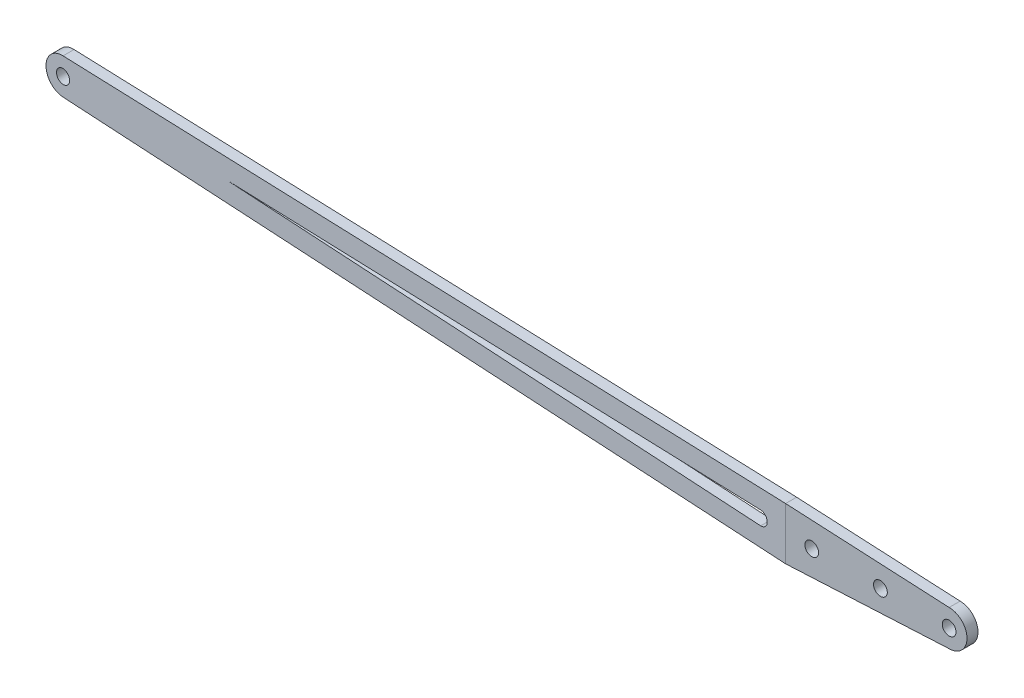
ISO-10303-21;
HEADER;
FILE_DESCRIPTION(('STEP AP214'),'2;1');
FILE_NAME('part.step','',(''),(''),'','','');
FILE_SCHEMA(('AUTOMOTIVE_DESIGN { 1 0 10303 214 1 1 1 1 }'));
ENDSEC;
DATA;
#1=APPLICATION_CONTEXT('core data for automotive mechanical design processes');
#2=APPLICATION_PROTOCOL_DEFINITION('international standard','automotive_design',2000,#1);
#3=PRODUCT_CONTEXT('',#1,'mechanical');
#4=PRODUCT('Part','Part','',(#3));
#5=PRODUCT_RELATED_PRODUCT_CATEGORY('part','',(#4));
#6=PRODUCT_DEFINITION_FORMATION('','',#4);
#7=PRODUCT_DEFINITION_CONTEXT('part definition',#1,'design');
#8=PRODUCT_DEFINITION('design','',#6,#7);
#9=PRODUCT_DEFINITION_SHAPE('','',#8);
#10=(LENGTH_UNIT() NAMED_UNIT(*) SI_UNIT(.MILLI.,.METRE.));
#11=(NAMED_UNIT(*) PLANE_ANGLE_UNIT() SI_UNIT($,.RADIAN.));
#12=(NAMED_UNIT(*) SI_UNIT($,.STERADIAN.) SOLID_ANGLE_UNIT());
#13=UNCERTAINTY_MEASURE_WITH_UNIT(LENGTH_MEASURE(1.E-05),#10,'distance_accuracy_value','');
#14=(GEOMETRIC_REPRESENTATION_CONTEXT(3) GLOBAL_UNCERTAINTY_ASSIGNED_CONTEXT((#13)) GLOBAL_UNIT_ASSIGNED_CONTEXT((#10,
#11,#12)) REPRESENTATION_CONTEXT('',''));
#15=CARTESIAN_POINT('',(0.,0.,0.));
#16=DIRECTION('',(0.,0.,1.));
#17=DIRECTION('',(1.,0.,0.));
#18=AXIS2_PLACEMENT_3D('',#15,#16,#17);
#19=CARTESIAN_POINT('',(0.0447099101226533,19.,-0.976698013369607));
#20=DIRECTION('',(-0.0457287086389354,0.,0.998953895435728));
#21=DIRECTION('',(0.998953895435728,0.,0.0457287086389354));
#22=AXIS2_PLACEMENT_3D('',#19,#20,#21);
#23=PLANE('',#22);
#24=DIRECTION('',(0.998878679740043,0.0122712368518434,0.0457252655204403));
#25=VECTOR('',#24,1.);
#26=CARTESIAN_POINT('',(0.119136479948843,12.9289820206382,-0.973291018370011));
#27=LINE('',#26,#25);
#28=CARTESIAN_POINT('',(-279.,9.5,-13.750414893617));
#29=VERTEX_POINT('',#28);
#30=CARTESIAN_POINT('',(-75.5,12.,-4.43487765957447));
#31=VERTEX_POINT('',#30);
#32=EDGE_CURVE('E423',#29,#31,#27,.T.);
#33=ORIENTED_EDGE('',*,*,#32,.F.);
#34=DIRECTION('',(-0.998878679740043,0.0122712368518431,-0.0457252655204403));
#35=VECTOR('',#34,1.);
#36=CARTESIAN_POINT('',(-0.113755580492739,6.07387906118547,-0.983952024072991));
#37=LINE('',#36,#35);
#38=CARTESIAN_POINT('',(-75.5,7.00000000000004,-4.43487765957447));
#39=VERTEX_POINT('',#38);
#40=EDGE_CURVE('E418',#39,#29,#37,.T.);
#41=ORIENTED_EDGE('',*,*,#40,.F.);
#42=CARTESIAN_POINT('',(-75.5,9.50000000000004,-4.43487765957447));
#43=DIRECTION('',(-0.0457287086389354,0.,0.998953895435728));
#44=DIRECTION('',(0.998953895435728,0.,0.0457287086389354));
#45=AXIS2_PLACEMENT_3D('',#42,#43,#44);
#46=ELLIPSE('',#45,2.50261800011254,2.5);
#47=EDGE_CURVE('E420',#39,#31,#46,.T.);
#48=ORIENTED_EDGE('',*,*,#47,.T.);
#49=EDGE_LOOP('',(#33,#41,#48));
#50=FACE_BOUND('',#49,.T.);
#51=CARTESIAN_POINT('',(-341.5,9.5,-16.6114521276595));
#52=DIRECTION('',(-0.0457287086389354,0.,0.998953895435728));
#53=DIRECTION('',(0.998953895435728,0.,0.0457287086389354));
#54=AXIS2_PLACEMENT_3D('',#51,#52,#53);
#55=ELLIPSE('',#54,2.50261800011257,2.50000000000002);
#56=CARTESIAN_POINT('',(-339.,9.5,-16.4970106382978));
#57=VERTEX_POINT('',#56);
#58=EDGE_CURVE('E415',#57,#57,#55,.T.);
#59=ORIENTED_EDGE('',*,*,#58,.T.);
#60=EDGE_LOOP('',(#59));
#61=FACE_BOUND('',#60,.T.);
#62=CARTESIAN_POINT('',(-341.5,9.5,-16.6114521276595));
#63=DIRECTION('',(-0.0457287086389354,0.,0.998953895435728));
#64=DIRECTION('',(0.998953895435728,0.,0.0457287086389354));
#65=AXIS2_PLACEMENT_3D('',#62,#63,#64);
#66=ELLIPSE('',#65,6.50680680029264,6.50000000000002);
#67=CARTESIAN_POINT('',(-341.5,16.,-16.6114521276595));
#68=VERTEX_POINT('',#67);
#69=CARTESIAN_POINT('',(-341.5,2.99999999999999,-16.6114521276595));
#70=VERTEX_POINT('',#69);
#71=EDGE_CURVE('E338',#68,#70,#66,.T.);
#72=ORIENTED_EDGE('',*,*,#71,.F.);
#73=DIRECTION('',(0.998894798208926,0.0108772573307686,0.0457260033690744));
#74=VECTOR('',#73,1.);
#75=CARTESIAN_POINT('',(0.036895848297217,19.7190950546094,-0.977055714518914));
#76=LINE('',#75,#74);
#77=CARTESIAN_POINT('',(-66.,19.,-4.));
#78=VERTEX_POINT('',#77);
#79=EDGE_CURVE('E341',#68,#78,#76,.T.);
#80=ORIENTED_EDGE('',*,*,#79,.T.);
#81=DIRECTION('',(0.,-1.,0.));
#82=VECTOR('',#81,1.);
#83=CARTESIAN_POINT('',(-66.,19.,-4.));
#84=LINE('',#83,#82);
#85=CARTESIAN_POINT('',(-66.,0.,-4.));
#86=VERTEX_POINT('',#85);
#87=EDGE_CURVE('E428',#78,#86,#84,.T.);
#88=ORIENTED_EDGE('',*,*,#87,.T.);
#89=DIRECTION('',(-0.998894798208926,0.0108772573307687,-0.0457260033690744));
#90=VECTOR('',#89,1.);
#91=CARTESIAN_POINT('',(-0.169543631265993,-0.716847074795648,-0.986505811120622));
#92=LINE('',#91,#90);
#93=EDGE_CURVE('E344',#86,#70,#92,.T.);
#94=ORIENTED_EDGE('',*,*,#93,.T.);
#95=EDGE_LOOP('',(#72,#80,#88,#94));
#96=FACE_BOUND('',#95,.T.);
#97=ADVANCED_FACE('F268',(#50,#61,#96),#23,.F.);
#98=CARTESIAN_POINT('',(-0.138013576389787,19.,3.01493752745526));
#99=DIRECTION('',(-0.0457287086389354,0.,0.998953895435728));
#100=DIRECTION('',(0.998953895435728,0.,0.0457287086389354));
#101=AXIS2_PLACEMENT_3D('',#98,#99,#100);
#102=PLANE('',#101);
#103=CARTESIAN_POINT('',(-341.5,9.5,-12.6114521276595));
#104=DIRECTION('',(-0.0457287086389354,0.,0.998953895435728));
#105=DIRECTION('',(0.998953895435728,0.,0.0457287086389354));
#106=AXIS2_PLACEMENT_3D('',#103,#104,#105);
#107=ELLIPSE('',#106,2.50261800011257,2.50000000000002);
#108=CARTESIAN_POINT('',(-339.,9.5,-12.4970106382978));
#109=VERTEX_POINT('',#108);
#110=EDGE_CURVE('E349',#109,#109,#107,.T.);
#111=ORIENTED_EDGE('',*,*,#110,.F.);
#112=EDGE_LOOP('',(#111));
#113=FACE_BOUND('',#112,.T.);
#114=DIRECTION('',(-0.998878679740043,0.0122712368518431,-0.0457252655204404));
#115=VECTOR('',#114,1.);
#116=CARTESIAN_POINT('',(-0.296451551908021,6.07612348343873,3.00768477629936));
#117=LINE('',#116,#115);
#118=CARTESIAN_POINT('',(-75.5,7.00000000000004,-0.434877659574454));
#119=VERTEX_POINT('',#118);
#120=CARTESIAN_POINT('',(-279.,9.5,-9.75041489361698));
#121=VERTEX_POINT('',#120);
#122=EDGE_CURVE('E434',#119,#121,#117,.T.);
#123=ORIENTED_EDGE('',*,*,#122,.T.);
#124=DIRECTION('',(0.998878679740043,0.0122712368518434,0.0457252655204404));
#125=VECTOR('',#124,1.);
#126=CARTESIAN_POINT('',(-0.0635594914664387,12.926737598385,3.01834578200234));
#127=LINE('',#126,#125);
#128=CARTESIAN_POINT('',(-75.5,12.,-0.434877659574458));
#129=VERTEX_POINT('',#128);
#130=EDGE_CURVE('E12',#121,#129,#127,.T.);
#131=ORIENTED_EDGE('',*,*,#130,.T.);
#132=CARTESIAN_POINT('',(-75.5,9.50000000000004,-0.434877659574458));
#133=DIRECTION('',(-0.0457287086389354,0.,0.998953895435728));
#134=DIRECTION('',(0.998953895435728,0.,0.0457287086389354));
#135=AXIS2_PLACEMENT_3D('',#132,#133,#134);
#136=ELLIPSE('',#135,2.50261800011254,2.5);
#137=EDGE_CURVE('E276',#119,#129,#136,.T.);
#138=ORIENTED_EDGE('',*,*,#137,.F.);
#139=EDGE_LOOP('',(#123,#131,#138));
#140=FACE_BOUND('',#139,.T.);
#141=DIRECTION('',(0.998894798208926,0.0108772573307686,0.0457260033690745));
#142=VECTOR('',#141,1.);
#143=CARTESIAN_POINT('',(-0.145806019335793,19.717105560588,3.01458081594466));
#144=LINE('',#143,#142);
#145=CARTESIAN_POINT('',(-341.5,16.,-12.6114521276595));
#146=VERTEX_POINT('',#145);
#147=CARTESIAN_POINT('',(-66.,19.,0.));
#148=VERTEX_POINT('',#147);
#149=EDGE_CURVE('E360',#146,#148,#144,.T.);
#150=ORIENTED_EDGE('',*,*,#149,.F.);
#151=CARTESIAN_POINT('',(-341.5,9.5,-12.6114521276595));
#152=DIRECTION('',(-0.0457287086389354,0.,0.998953895435728));
#153=DIRECTION('',(0.998953895435728,0.,0.0457287086389354));
#154=AXIS2_PLACEMENT_3D('',#151,#152,#153);
#155=ELLIPSE('',#154,6.50680680029264,6.50000000000002);
#156=CARTESIAN_POINT('',(-341.5,2.99999999999999,-12.6114521276595));
#157=VERTEX_POINT('',#156);
#158=EDGE_CURVE('E364',#146,#157,#155,.T.);
#159=ORIENTED_EDGE('',*,*,#158,.T.);
#160=DIRECTION('',(-0.998894798208926,0.0108772573307687,-0.0457260033690745));
#161=VECTOR('',#160,1.);
#162=CARTESIAN_POINT('',(-0.352245498899002,-0.714857580774234,3.00513071934295));
#163=LINE('',#162,#161);
#164=CARTESIAN_POINT('',(-66.,0.,0.));
#165=VERTEX_POINT('',#164);
#166=EDGE_CURVE('E408',#165,#157,#163,.T.);
#167=ORIENTED_EDGE('',*,*,#166,.F.);
#168=DIRECTION('',(0.,-1.,0.));
#169=VECTOR('',#168,1.);
#170=CARTESIAN_POINT('',(-66.,19.,0.));
#171=LINE('',#170,#169);
#172=EDGE_CURVE('E425',#148,#165,#171,.T.);
#173=ORIENTED_EDGE('',*,*,#172,.F.);
#174=EDGE_LOOP('',(#150,#159,#167,#173));
#175=FACE_BOUND('',#174,.T.);
#176=ADVANCED_FACE('F446',(#113,#140,#175),#102,.T.);
#177=CARTESIAN_POINT('',(0.,19.,-4.));
#178=DIRECTION('',(0.,0.,-1.));
#179=DIRECTION('',(-1.,0.,0.));
#180=AXIS2_PLACEMENT_3D('',#177,#178,#179);
#181=PLANE('',#180);
#182=CARTESIAN_POINT('',(-56.5,9.49999999999999,-4.));
#183=DIRECTION('',(0.,0.,-1.));
#184=DIRECTION('',(-1.,0.,0.));
#185=AXIS2_PLACEMENT_3D('',#182,#183,#184);
#186=CIRCLE('',#185,2.49999999999999);
#187=CARTESIAN_POINT('',(-59.,9.49999999999999,-4.));
#188=VERTEX_POINT('',#187);
#189=EDGE_CURVE('E390',#188,#188,#186,.T.);
#190=ORIENTED_EDGE('',*,*,#189,.F.);
#191=EDGE_LOOP('',(#190));
#192=FACE_BOUND('',#191,.T.);
#193=CARTESIAN_POINT('',(-31.5,9.5,-4.));
#194=DIRECTION('',(0.,0.,-1.));
#195=DIRECTION('',(-1.,0.,0.));
#196=AXIS2_PLACEMENT_3D('',#193,#194,#195);
#197=CIRCLE('',#196,2.49999999999999);
#198=CARTESIAN_POINT('',(-34.,9.5,-4.));
#199=VERTEX_POINT('',#198);
#200=EDGE_CURVE('E387',#199,#199,#197,.T.);
#201=ORIENTED_EDGE('',*,*,#200,.F.);
#202=EDGE_LOOP('',(#201));
#203=FACE_BOUND('',#202,.T.);
#204=CARTESIAN_POINT('',(-6.5,9.5,-4.));
#205=DIRECTION('',(0.,0.,-1.));
#206=DIRECTION('',(-1.,0.,0.));
#207=AXIS2_PLACEMENT_3D('',#204,#205,#206);
#208=CIRCLE('',#207,2.5);
#209=CARTESIAN_POINT('',(-9.,9.5,-4.));
#210=VERTEX_POINT('',#209);
#211=EDGE_CURVE('E384',#210,#210,#208,.T.);
#212=ORIENTED_EDGE('',*,*,#211,.F.);
#213=EDGE_LOOP('',(#212));
#214=FACE_BOUND('',#213,.T.);
#215=CARTESIAN_POINT('',(-6.5,9.5,-4.));
#216=DIRECTION('',(0.,0.,-1.));
#217=DIRECTION('',(-1.,0.,0.));
#218=AXIS2_PLACEMENT_3D('',#215,#216,#217);
#219=CIRCLE('',#218,6.5);
#220=CARTESIAN_POINT('',(-6.5,16.,-4.));
#221=VERTEX_POINT('',#220);
#222=CARTESIAN_POINT('',(-6.5,3.,-4.));
#223=VERTEX_POINT('',#222);
#224=EDGE_CURVE('E350',#221,#223,#219,.T.);
#225=ORIENTED_EDGE('',*,*,#224,.T.);
#226=DIRECTION('',(0.998731321733328,0.0503562010957981,0.));
#227=VECTOR('',#226,1.);
#228=CARTESIAN_POINT('',(0.788194689018808,3.367472001127,-4.));
#229=LINE('',#228,#227);
#230=EDGE_CURVE('E381',#86,#223,#229,.T.);
#231=ORIENTED_EDGE('',*,*,#230,.F.);
#232=ORIENTED_EDGE('',*,*,#87,.F.);
#233=DIRECTION('',(0.998731321733328,-0.050356201095798,0.));
#234=VECTOR('',#233,1.);
#235=CARTESIAN_POINT('',(-0.16735930126083,15.6807071916602,-4.));
#236=LINE('',#235,#234);
#237=EDGE_CURVE('E411',#78,#221,#236,.T.);
#238=ORIENTED_EDGE('',*,*,#237,.T.);
#239=EDGE_LOOP('',(#225,#231,#232,#238));
#240=FACE_BOUND('',#239,.T.);
#241=ADVANCED_FACE('F270',(#192,#203,#214,#240),#181,.T.);
#242=CARTESIAN_POINT('',(0.,19.,0.));
#243=DIRECTION('',(0.,0.,1.));
#244=DIRECTION('',(1.,0.,0.));
#245=AXIS2_PLACEMENT_3D('',#242,#243,#244);
#246=PLANE('',#245);
#247=CARTESIAN_POINT('',(-56.5,9.49999999999999,0.));
#248=DIRECTION('',(0.,0.,1.));
#249=DIRECTION('',(1.,0.,0.));
#250=AXIS2_PLACEMENT_3D('',#247,#248,#249);
#251=CIRCLE('',#250,2.49999999999999);
#252=CARTESIAN_POINT('',(-54.,9.49999999999999,0.));
#253=VERTEX_POINT('',#252);
#254=EDGE_CURVE('E359',#253,#253,#251,.T.);
#255=ORIENTED_EDGE('',*,*,#254,.F.);
#256=EDGE_LOOP('',(#255));
#257=FACE_BOUND('',#256,.T.);
#258=CARTESIAN_POINT('',(-31.5,9.5,0.));
#259=DIRECTION('',(0.,0.,1.));
#260=DIRECTION('',(1.,0.,0.));
#261=AXIS2_PLACEMENT_3D('',#258,#259,#260);
#262=CIRCLE('',#261,2.49999999999999);
#263=CARTESIAN_POINT('',(-29.,9.5,0.));
#264=VERTEX_POINT('',#263);
#265=EDGE_CURVE('E368',#264,#264,#262,.T.);
#266=ORIENTED_EDGE('',*,*,#265,.F.);
#267=EDGE_LOOP('',(#266));
#268=FACE_BOUND('',#267,.T.);
#269=CARTESIAN_POINT('',(-6.5,9.5,0.));
#270=DIRECTION('',(0.,0.,1.));
#271=DIRECTION('',(1.,0.,0.));
#272=AXIS2_PLACEMENT_3D('',#269,#270,#271);
#273=CIRCLE('',#272,2.5);
#274=CARTESIAN_POINT('',(-4.,9.5,0.));
#275=VERTEX_POINT('',#274);
#276=EDGE_CURVE('E371',#275,#275,#273,.T.);
#277=ORIENTED_EDGE('',*,*,#276,.F.);
#278=EDGE_LOOP('',(#277));
#279=FACE_BOUND('',#278,.T.);
#280=DIRECTION('',(-0.998731321733328,-0.0503562010957981,0.));
#281=VECTOR('',#280,1.);
#282=CARTESIAN_POINT('',(-0.16735930126083,3.31929280833979,0.));
#283=LINE('',#282,#281);
#284=CARTESIAN_POINT('',(-6.5,3.,0.));
#285=VERTEX_POINT('',#284);
#286=EDGE_CURVE('E376',#285,#165,#283,.T.);
#287=ORIENTED_EDGE('',*,*,#286,.F.);
#288=CARTESIAN_POINT('',(-6.5,9.5,0.));
#289=DIRECTION('',(0.,0.,1.));
#290=DIRECTION('',(1.,0.,0.));
#291=AXIS2_PLACEMENT_3D('',#288,#289,#290);
#292=CIRCLE('',#291,6.5);
#293=CARTESIAN_POINT('',(-6.5,16.,0.));
#294=VERTEX_POINT('',#293);
#295=EDGE_CURVE('E398',#285,#294,#292,.T.);
#296=ORIENTED_EDGE('',*,*,#295,.T.);
#297=DIRECTION('',(-0.998731321733328,0.050356201095798,0.));
#298=VECTOR('',#297,1.);
#299=CARTESIAN_POINT('',(0.788194689018806,15.632527998873,0.));
#300=LINE('',#299,#298);
#301=EDGE_CURVE('E403',#294,#148,#300,.T.);
#302=ORIENTED_EDGE('',*,*,#301,.T.);
#303=ORIENTED_EDGE('',*,*,#172,.T.);
#304=EDGE_LOOP('',(#287,#296,#302,#303));
#305=FACE_BOUND('',#304,.T.);
#306=ADVANCED_FACE('F471',(#257,#268,#279,#305),#246,.T.);
#307=CARTESIAN_POINT('',(-341.5,9.5,-40.));
#308=DIRECTION('',(0.,0.,1.));
#309=DIRECTION('',(1.,0.,0.));
#310=AXIS2_PLACEMENT_3D('',#307,#308,#309);
#311=CYLINDRICAL_SURFACE('',#310,6.50000000000002);
#312=ORIENTED_EDGE('',*,*,#71,.T.);
#313=DIRECTION('',(0.,0.,1.));
#314=VECTOR('',#313,1.);
#315=CARTESIAN_POINT('',(-341.5,2.99999999999999,-40.));
#316=LINE('',#315,#314);
#317=EDGE_CURVE('E393',#70,#157,#316,.T.);
#318=ORIENTED_EDGE('',*,*,#317,.T.);
#319=ORIENTED_EDGE('',*,*,#158,.F.);
#320=DIRECTION('',(0.,0.,1.));
#321=VECTOR('',#320,1.);
#322=CARTESIAN_POINT('',(-341.5,16.,-40.));
#323=LINE('',#322,#321);
#324=EDGE_CURVE('E355',#68,#146,#323,.T.);
#325=ORIENTED_EDGE('',*,*,#324,.F.);
#326=EDGE_LOOP('',(#312,#318,#319,#325));
#327=FACE_BOUND('',#326,.T.);
#328=ADVANCED_FACE('F362',(#327),#311,.T.);
#329=CARTESIAN_POINT('',(-0.00782513330061876,-0.718608074773493,-40.));
#330=DIRECTION('',(0.0108886466453343,0.999940716929875,0.));
#331=DIRECTION('',(-0.999940716929875,0.0108886466453343,0.));
#332=AXIS2_PLACEMENT_3D('',#329,#330,#331);
#333=PLANE('',#332);
#334=DIRECTION('',(0.,0.,-1.));
#335=VECTOR('',#334,1.);
#336=CARTESIAN_POINT('',(-66.,0.,0.));
#337=LINE('',#336,#335);
#338=EDGE_CURVE('E430',#165,#86,#337,.T.);
#339=ORIENTED_EDGE('',*,*,#338,.F.);
#340=ORIENTED_EDGE('',*,*,#166,.T.);
#341=ORIENTED_EDGE('',*,*,#317,.F.);
#342=ORIENTED_EDGE('',*,*,#93,.F.);
#343=EDGE_LOOP('',(#339,#340,#341,#342));
#344=FACE_BOUND('',#343,.T.);
#345=ADVANCED_FACE('F479',(#344),#333,.F.);
#346=CARTESIAN_POINT('',(-6.5,9.5,-40.));
#347=DIRECTION('',(0.,0.,1.));
#348=DIRECTION('',(1.,0.,0.));
#349=AXIS2_PLACEMENT_3D('',#346,#347,#348);
#350=CYLINDRICAL_SURFACE('',#349,6.5);
#351=DIRECTION('',(0.,0.,1.));
#352=VECTOR('',#351,1.);
#353=CARTESIAN_POINT('',(-6.5,16.,-40.));
#354=LINE('',#353,#352);
#355=EDGE_CURVE('E406',#221,#294,#354,.T.);
#356=ORIENTED_EDGE('',*,*,#355,.T.);
#357=ORIENTED_EDGE('',*,*,#295,.F.);
#358=DIRECTION('',(0.,0.,1.));
#359=VECTOR('',#358,1.);
#360=CARTESIAN_POINT('',(-6.5,3.,-40.));
#361=LINE('',#360,#359);
#362=EDGE_CURVE('E378',#223,#285,#361,.T.);
#363=ORIENTED_EDGE('',*,*,#362,.F.);
#364=ORIENTED_EDGE('',*,*,#224,.F.);
#365=EDGE_LOOP('',(#356,#357,#363,#364));
#366=FACE_BOUND('',#365,.T.);
#367=ADVANCED_FACE('F475',(#366),#350,.T.);
#368=CARTESIAN_POINT('',(0.788194689018806,15.632527998873,-40.));
#369=DIRECTION('',(0.050356201095798,0.998731321733328,0.));
#370=DIRECTION('',(-0.998731321733328,0.050356201095798,0.));
#371=AXIS2_PLACEMENT_3D('',#368,#369,#370);
#372=PLANE('',#371);
#373=DIRECTION('',(0.,0.,-1.));
#374=VECTOR('',#373,1.);
#375=CARTESIAN_POINT('',(-66.,19.,0.));
#376=LINE('',#375,#374);
#377=EDGE_CURVE('E358',#148,#78,#376,.T.);
#378=ORIENTED_EDGE('',*,*,#377,.F.);
#379=ORIENTED_EDGE('',*,*,#301,.F.);
#380=ORIENTED_EDGE('',*,*,#355,.F.);
#381=ORIENTED_EDGE('',*,*,#237,.F.);
#382=EDGE_LOOP('',(#378,#379,#380,#381));
#383=FACE_BOUND('',#382,.T.);
#384=ADVANCED_FACE('F478',(#383),#372,.T.);
#385=CARTESIAN_POINT('',(-341.5,9.5,-40.));
#386=DIRECTION('',(0.,0.,1.));
#387=DIRECTION('',(1.,0.,0.));
#388=AXIS2_PLACEMENT_3D('',#385,#386,#387);
#389=CYLINDRICAL_SURFACE('',#388,2.50000000000002);
#390=ORIENTED_EDGE('',*,*,#110,.T.);
#391=EDGE_LOOP('',(#390));
#392=FACE_BOUND('',#391,.T.);
#393=ORIENTED_EDGE('',*,*,#58,.F.);
#394=EDGE_LOOP('',(#393));
#395=FACE_BOUND('',#394,.T.);
#396=ADVANCED_FACE('F483',(#392,#395),#389,.F.);
#397=CARTESIAN_POINT('',(-0.15879075775318,12.9255676811087,-40.));
#398=DIRECTION('',(0.0122840853535259,-0.999924547776995,0.));
#399=DIRECTION('',(0.999924547776995,0.0122840853535259,0.));
#400=AXIS2_PLACEMENT_3D('',#397,#398,#399);
#401=PLANE('',#400);
#402=ORIENTED_EDGE('',*,*,#32,.T.);
#403=DIRECTION('',(0.,0.,1.));
#404=VECTOR('',#403,1.);
#405=CARTESIAN_POINT('',(-75.5,12.,-40.));
#406=LINE('',#405,#404);
#407=EDGE_CURVE('E395',#31,#129,#406,.T.);
#408=ORIENTED_EDGE('',*,*,#407,.T.);
#409=ORIENTED_EDGE('',*,*,#130,.F.);
#410=DIRECTION('',(0.,0.,1.));
#411=VECTOR('',#410,1.);
#412=CARTESIAN_POINT('',(-279.,9.5,-40.));
#413=LINE('',#412,#411);
#414=EDGE_CURVE('E288',#29,#121,#413,.T.);
#415=ORIENTED_EDGE('',*,*,#414,.F.);
#416=EDGE_LOOP('',(#402,#408,#409,#415));
#417=FACE_BOUND('',#416,.T.);
#418=ADVANCED_FACE('F444',(#417),#401,.T.);
#419=CARTESIAN_POINT('',(-75.5,9.50000000000004,-40.));
#420=DIRECTION('',(0.,0.,1.));
#421=DIRECTION('',(1.,0.,0.));
#422=AXIS2_PLACEMENT_3D('',#419,#420,#421);
#423=CYLINDRICAL_SURFACE('',#422,2.5);
#424=DIRECTION('',(0.,0.,1.));
#425=VECTOR('',#424,1.);
#426=CARTESIAN_POINT('',(-75.5,7.00000000000004,-40.));
#427=LINE('',#426,#425);
#428=EDGE_CURVE('E283',#39,#119,#427,.T.);
#429=ORIENTED_EDGE('',*,*,#428,.T.);
#430=ORIENTED_EDGE('',*,*,#137,.T.);
#431=ORIENTED_EDGE('',*,*,#407,.F.);
#432=ORIENTED_EDGE('',*,*,#47,.F.);
#433=EDGE_LOOP('',(#429,#430,#431,#432));
#434=FACE_BOUND('',#433,.T.);
#435=ADVANCED_FACE('F441',(#434),#423,.F.);
#436=CARTESIAN_POINT('',(0.0745892535944078,6.07156524258489,-40.));
#437=DIRECTION('',(0.0122840853535255,0.999924547776995,0.));
#438=DIRECTION('',(-0.999924547776995,0.0122840853535255,0.));
#439=AXIS2_PLACEMENT_3D('',#436,#437,#438);
#440=PLANE('',#439);
#441=ORIENTED_EDGE('',*,*,#40,.T.);
#442=ORIENTED_EDGE('',*,*,#414,.T.);
#443=ORIENTED_EDGE('',*,*,#122,.F.);
#444=ORIENTED_EDGE('',*,*,#428,.F.);
#445=EDGE_LOOP('',(#441,#442,#443,#444));
#446=FACE_BOUND('',#445,.T.);
#447=ADVANCED_FACE('F448',(#446),#440,.T.);
#448=CARTESIAN_POINT('',(-0.16735930126083,3.31929280833979,-40.));
#449=DIRECTION('',(-0.0503562010957981,0.998731321733328,0.));
#450=DIRECTION('',(-0.998731321733328,-0.0503562010957981,0.));
#451=AXIS2_PLACEMENT_3D('',#448,#449,#450);
#452=PLANE('',#451);
#453=ORIENTED_EDGE('',*,*,#230,.T.);
#454=ORIENTED_EDGE('',*,*,#362,.T.);
#455=ORIENTED_EDGE('',*,*,#286,.T.);
#456=ORIENTED_EDGE('',*,*,#338,.T.);
#457=EDGE_LOOP('',(#453,#454,#455,#456));
#458=FACE_BOUND('',#457,.T.);
#459=ADVANCED_FACE('F451',(#458),#452,.F.);
#460=CARTESIAN_POINT('',(-6.5,9.5,-40.));
#461=DIRECTION('',(0.,0.,1.));
#462=DIRECTION('',(1.,0.,0.));
#463=AXIS2_PLACEMENT_3D('',#460,#461,#462);
#464=CYLINDRICAL_SURFACE('',#463,2.5);
#465=ORIENTED_EDGE('',*,*,#211,.T.);
#466=EDGE_LOOP('',(#465));
#467=FACE_BOUND('',#466,.T.);
#468=ORIENTED_EDGE('',*,*,#276,.T.);
#469=EDGE_LOOP('',(#468));
#470=FACE_BOUND('',#469,.T.);
#471=ADVANCED_FACE('F457',(#467,#470),#464,.F.);
#472=CARTESIAN_POINT('',(-31.5,9.5,-40.));
#473=DIRECTION('',(0.,0.,1.));
#474=DIRECTION('',(1.,0.,0.));
#475=AXIS2_PLACEMENT_3D('',#472,#473,#474);
#476=CYLINDRICAL_SURFACE('',#475,2.49999999999999);
#477=ORIENTED_EDGE('',*,*,#200,.T.);
#478=EDGE_LOOP('',(#477));
#479=FACE_BOUND('',#478,.T.);
#480=ORIENTED_EDGE('',*,*,#265,.T.);
#481=EDGE_LOOP('',(#480));
#482=FACE_BOUND('',#481,.T.);
#483=ADVANCED_FACE('F516',(#479,#482),#476,.F.);
#484=CARTESIAN_POINT('',(-56.5,9.49999999999999,-40.));
#485=DIRECTION('',(0.,0.,1.));
#486=DIRECTION('',(1.,0.,0.));
#487=AXIS2_PLACEMENT_3D('',#484,#485,#486);
#488=CYLINDRICAL_SURFACE('',#487,2.49999999999999);
#489=ORIENTED_EDGE('',*,*,#189,.T.);
#490=EDGE_LOOP('',(#489));
#491=FACE_BOUND('',#490,.T.);
#492=ORIENTED_EDGE('',*,*,#254,.T.);
#493=EDGE_LOOP('',(#492));
#494=FACE_BOUND('',#493,.T.);
#495=ADVANCED_FACE('F526',(#491,#494),#488,.F.);
#496=CARTESIAN_POINT('',(-0.214697154826321,19.7163553848839,-40.));
#497=DIRECTION('',(0.0108886466453343,-0.999940716929875,0.));
#498=DIRECTION('',(0.999940716929875,0.0108886466453343,0.));
#499=AXIS2_PLACEMENT_3D('',#496,#497,#498);
#500=PLANE('',#499);
#501=ORIENTED_EDGE('',*,*,#324,.T.);
#502=ORIENTED_EDGE('',*,*,#149,.T.);
#503=ORIENTED_EDGE('',*,*,#377,.T.);
#504=ORIENTED_EDGE('',*,*,#79,.F.);
#505=EDGE_LOOP('',(#501,#502,#503,#504));
#506=FACE_BOUND('',#505,.T.);
#507=ADVANCED_FACE('F354',(#506),#500,.F.);
#508=CLOSED_SHELL('',(#97,#176,#241,#306,#328,#345,#367,#384,#396,#418,#435,#447,#459,#471,#483,
#495,#507));
#509=MANIFOLD_SOLID_BREP('B2',#508);
#510=ADVANCED_BREP_SHAPE_REPRESENTATION('',(#18,#509),#14);
#511=SHAPE_DEFINITION_REPRESENTATION(#9,#510);
ENDSEC;
END-ISO-10303-21;
